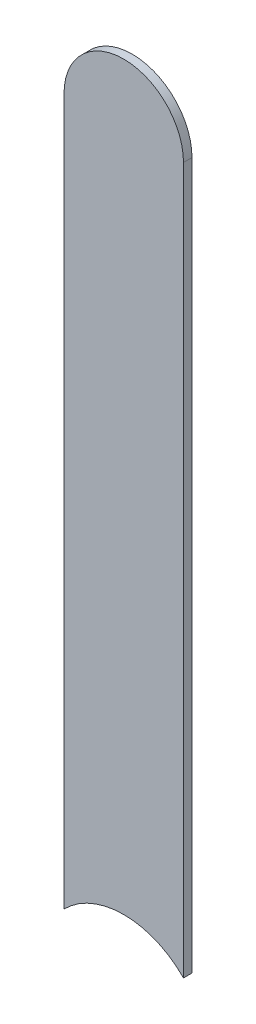
ISO-10303-21;
HEADER;
FILE_DESCRIPTION(('STEP AP214'),'2;1');
FILE_NAME('part.step','',(''),(''),'','','');
FILE_SCHEMA(('AUTOMOTIVE_DESIGN { 1 0 10303 214 1 1 1 1 }'));
ENDSEC;
DATA;
#1=APPLICATION_CONTEXT('core data for automotive mechanical design processes');
#2=APPLICATION_PROTOCOL_DEFINITION('international standard','automotive_design',2000,#1);
#3=PRODUCT_CONTEXT('',#1,'mechanical');
#4=PRODUCT('Part','Part','',(#3));
#5=PRODUCT_RELATED_PRODUCT_CATEGORY('part','',(#4));
#6=PRODUCT_DEFINITION_FORMATION('','',#4);
#7=PRODUCT_DEFINITION_CONTEXT('part definition',#1,'design');
#8=PRODUCT_DEFINITION('design','',#6,#7);
#9=PRODUCT_DEFINITION_SHAPE('','',#8);
#10=(LENGTH_UNIT() NAMED_UNIT(*) SI_UNIT(.MILLI.,.METRE.));
#11=(NAMED_UNIT(*) PLANE_ANGLE_UNIT() SI_UNIT($,.RADIAN.));
#12=(NAMED_UNIT(*) SI_UNIT($,.STERADIAN.) SOLID_ANGLE_UNIT());
#13=UNCERTAINTY_MEASURE_WITH_UNIT(LENGTH_MEASURE(1.E-05),#10,'distance_accuracy_value','');
#14=(GEOMETRIC_REPRESENTATION_CONTEXT(3) GLOBAL_UNCERTAINTY_ASSIGNED_CONTEXT((#13)) GLOBAL_UNIT_ASSIGNED_CONTEXT((#10,
#11,#12)) REPRESENTATION_CONTEXT('',''));
#15=CARTESIAN_POINT('',(0.,0.,0.));
#16=DIRECTION('',(0.,0.,1.));
#17=DIRECTION('',(1.,0.,0.));
#18=AXIS2_PLACEMENT_3D('',#15,#16,#17);
#19=CARTESIAN_POINT('',(110.7166315,98.0850372843804,0.));
#20=DIRECTION('',(-1.,0.,0.));
#21=DIRECTION('',(0.,1.,0.));
#22=AXIS2_PLACEMENT_3D('',#19,#20,#21);
#23=PLANE('',#22);
#24=DIRECTION('',(0.,1.,0.));
#25=VECTOR('',#24,1.);
#26=CARTESIAN_POINT('',(110.7166315,97.8400888,0.03556));
#27=LINE('',#26,#25);
#28=CARTESIAN_POINT('',(110.7166315,98.0850372843804,0.03556));
#29=VERTEX_POINT('',#28);
#30=CARTESIAN_POINT('',(110.7166315,101.0412,0.03556));
#31=VERTEX_POINT('',#30);
#32=EDGE_CURVE('E11',#29,#31,#27,.T.);
#33=ORIENTED_EDGE('',*,*,#32,.F.);
#34=DIRECTION('',(0.,0.,1.));
#35=VECTOR('',#34,1.);
#36=CARTESIAN_POINT('',(110.7166315,98.0850372843804,0.));
#37=LINE('',#36,#35);
#38=CARTESIAN_POINT('',(110.7166315,98.0850372843804,0.));
#39=VERTEX_POINT('',#38);
#40=EDGE_CURVE('E24',#39,#29,#37,.T.);
#41=ORIENTED_EDGE('',*,*,#40,.F.);
#42=DIRECTION('',(0.,1.,0.));
#43=VECTOR('',#42,1.);
#44=CARTESIAN_POINT('',(110.7166315,97.8400888,0.));
#45=LINE('',#44,#43);
#46=CARTESIAN_POINT('',(110.7166315,101.0412,0.));
#47=VERTEX_POINT('',#46);
#48=EDGE_CURVE('E75',#39,#47,#45,.T.);
#49=ORIENTED_EDGE('',*,*,#48,.T.);
#50=DIRECTION('',(0.,0.,1.));
#51=VECTOR('',#50,1.);
#52=CARTESIAN_POINT('',(110.7166315,101.0412,0.));
#53=LINE('',#52,#51);
#54=EDGE_CURVE('E37',#47,#31,#53,.T.);
#55=ORIENTED_EDGE('',*,*,#54,.T.);
#56=EDGE_LOOP('',(#33,#41,#49,#55));
#57=FACE_BOUND('',#56,.T.);
#58=ADVANCED_FACE('F17',(#57),#23,.F.);
#59=CARTESIAN_POINT('',(110.466632,101.0412,0.));
#60=DIRECTION('',(0.,0.,-1.));
#61=DIRECTION('',(1.,0.,0.));
#62=AXIS2_PLACEMENT_3D('',#59,#60,#61);
#63=CYLINDRICAL_SURFACE('',#62,0.249999500000001);
#64=CARTESIAN_POINT('',(110.466632,101.0412,0.03556));
#65=DIRECTION('',(0.,0.,1.));
#66=DIRECTION('',(1.,0.,0.));
#67=AXIS2_PLACEMENT_3D('',#64,#65,#66);
#68=CIRCLE('',#67,0.249999500000001);
#69=CARTESIAN_POINT('',(110.2166325,101.0412,0.03556));
#70=VERTEX_POINT('',#69);
#71=EDGE_CURVE('E83',#31,#70,#68,.T.);
#72=ORIENTED_EDGE('',*,*,#71,.F.);
#73=ORIENTED_EDGE('',*,*,#54,.F.);
#74=CARTESIAN_POINT('',(110.466632,101.0412,0.));
#75=DIRECTION('',(0.,0.,1.));
#76=DIRECTION('',(1.,0.,0.));
#77=AXIS2_PLACEMENT_3D('',#74,#75,#76);
#78=CIRCLE('',#77,0.249999500000001);
#79=CARTESIAN_POINT('',(110.2166325,101.0412,0.));
#80=VERTEX_POINT('',#79);
#81=EDGE_CURVE('E81',#47,#80,#78,.T.);
#82=ORIENTED_EDGE('',*,*,#81,.T.);
#83=DIRECTION('',(0.,0.,1.));
#84=VECTOR('',#83,1.);
#85=CARTESIAN_POINT('',(110.2166325,101.0412,0.));
#86=LINE('',#85,#84);
#87=EDGE_CURVE('E67',#80,#70,#86,.T.);
#88=ORIENTED_EDGE('',*,*,#87,.T.);
#89=EDGE_LOOP('',(#72,#73,#82,#88));
#90=FACE_BOUND('',#89,.T.);
#91=ADVANCED_FACE('F89',(#90),#63,.T.);
#92=CARTESIAN_POINT('',(110.2166325,101.0412,0.));
#93=DIRECTION('',(1.,0.,0.));
#94=DIRECTION('',(0.,-1.,0.));
#95=AXIS2_PLACEMENT_3D('',#92,#93,#94);
#96=PLANE('',#95);
#97=DIRECTION('',(0.,-1.,0.));
#98=VECTOR('',#97,1.);
#99=CARTESIAN_POINT('',(110.2166325,101.0412,0.03556));
#100=LINE('',#99,#98);
#101=CARTESIAN_POINT('',(110.2166325,98.0850372843803,0.03556));
#102=VERTEX_POINT('',#101);
#103=EDGE_CURVE('E71',#70,#102,#100,.T.);
#104=ORIENTED_EDGE('',*,*,#103,.F.);
#105=ORIENTED_EDGE('',*,*,#87,.F.);
#106=DIRECTION('',(0.,-1.,0.));
#107=VECTOR('',#106,1.);
#108=CARTESIAN_POINT('',(110.2166325,101.0412,0.));
#109=LINE('',#108,#107);
#110=CARTESIAN_POINT('',(110.2166325,98.0850372843803,0.));
#111=VERTEX_POINT('',#110);
#112=EDGE_CURVE('E63',#80,#111,#109,.T.);
#113=ORIENTED_EDGE('',*,*,#112,.T.);
#114=DIRECTION('',(0.,0.,1.));
#115=VECTOR('',#114,1.);
#116=CARTESIAN_POINT('',(110.2166325,98.0850372843803,0.));
#117=LINE('',#116,#115);
#118=EDGE_CURVE('E53',#111,#102,#117,.T.);
#119=ORIENTED_EDGE('',*,*,#118,.T.);
#120=EDGE_LOOP('',(#104,#105,#113,#119));
#121=FACE_BOUND('',#120,.T.);
#122=ADVANCED_FACE('F66',(#121),#96,.F.);
#123=CARTESIAN_POINT('',(110.466632,97.8400888,0.));
#124=DIRECTION('',(0.,0.,-1.));
#125=DIRECTION('',(1.,0.,0.));
#126=AXIS2_PLACEMENT_3D('',#123,#124,#125);
#127=CYLINDRICAL_SURFACE('',#126,0.3499993);
#128=ORIENTED_EDGE('',*,*,#40,.T.);
#129=CARTESIAN_POINT('',(110.466632,97.8400888,0.03556));
#130=DIRECTION('',(0.,0.,1.));
#131=DIRECTION('',(1.,0.,0.));
#132=AXIS2_PLACEMENT_3D('',#129,#130,#131);
#133=CIRCLE('',#132,0.3499993);
#134=EDGE_CURVE('E59',#29,#102,#133,.T.);
#135=ORIENTED_EDGE('',*,*,#134,.T.);
#136=ORIENTED_EDGE('',*,*,#118,.F.);
#137=CARTESIAN_POINT('',(110.466632,97.8400888,0.));
#138=DIRECTION('',(0.,0.,1.));
#139=DIRECTION('',(1.,0.,0.));
#140=AXIS2_PLACEMENT_3D('',#137,#138,#139);
#141=CIRCLE('',#140,0.3499993);
#142=EDGE_CURVE('E57',#39,#111,#141,.T.);
#143=ORIENTED_EDGE('',*,*,#142,.F.);
#144=EDGE_LOOP('',(#128,#135,#136,#143));
#145=FACE_BOUND('',#144,.T.);
#146=ADVANCED_FACE('F55',(#145),#127,.F.);
#147=CARTESIAN_POINT('',(110.7166315,97.8400888,0.));
#148=DIRECTION('',(0.,0.,-1.));
#149=DIRECTION('',(-1.,0.,0.));
#150=AXIS2_PLACEMENT_3D('',#147,#148,#149);
#151=PLANE('',#150);
#152=ORIENTED_EDGE('',*,*,#48,.F.);
#153=ORIENTED_EDGE('',*,*,#142,.T.);
#154=ORIENTED_EDGE('',*,*,#112,.F.);
#155=ORIENTED_EDGE('',*,*,#81,.F.);
#156=EDGE_LOOP('',(#152,#153,#154,#155));
#157=FACE_BOUND('',#156,.T.);
#158=ADVANCED_FACE('F74',(#157),#151,.T.);
#159=CARTESIAN_POINT('',(110.7166315,97.8400888,0.03556));
#160=DIRECTION('',(0.,0.,-1.));
#161=DIRECTION('',(-1.,0.,0.));
#162=AXIS2_PLACEMENT_3D('',#159,#160,#161);
#163=PLANE('',#162);
#164=ORIENTED_EDGE('',*,*,#134,.F.);
#165=ORIENTED_EDGE('',*,*,#32,.T.);
#166=ORIENTED_EDGE('',*,*,#71,.T.);
#167=ORIENTED_EDGE('',*,*,#103,.T.);
#168=EDGE_LOOP('',(#164,#165,#166,#167));
#169=FACE_BOUND('',#168,.T.);
#170=ADVANCED_FACE('F91',(#169),#163,.F.);
#171=CLOSED_SHELL('',(#58,#91,#122,#146,#158,#170));
#172=MANIFOLD_SOLID_BREP('B1',#171);
#173=ADVANCED_BREP_SHAPE_REPRESENTATION('',(#18,#172),#14);
#174=SHAPE_DEFINITION_REPRESENTATION(#9,#173);
ENDSEC;
END-ISO-10303-21;
